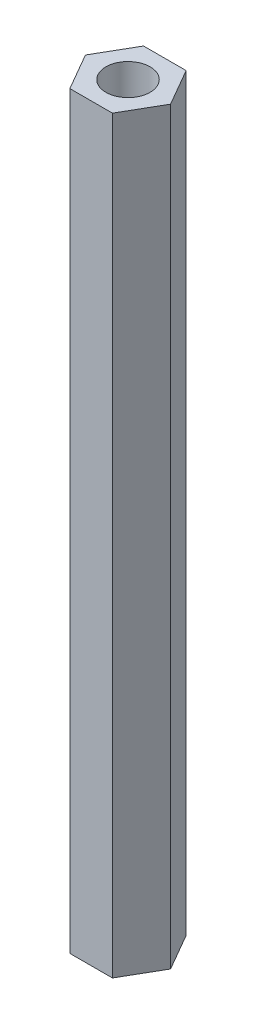
ISO-10303-21;
HEADER;
FILE_DESCRIPTION(('STEP AP214'),'2;1');
FILE_NAME('part.step','',(''),(''),'','','');
FILE_SCHEMA(('AUTOMOTIVE_DESIGN { 1 0 10303 214 1 1 1 1 }'));
ENDSEC;
DATA;
#1=APPLICATION_CONTEXT('core data for automotive mechanical design processes');
#2=APPLICATION_PROTOCOL_DEFINITION('international standard','automotive_design',2000,#1);
#3=PRODUCT_CONTEXT('',#1,'mechanical');
#4=PRODUCT('Part','Part','',(#3));
#5=PRODUCT_RELATED_PRODUCT_CATEGORY('part','',(#4));
#6=PRODUCT_DEFINITION_FORMATION('','',#4);
#7=PRODUCT_DEFINITION_CONTEXT('part definition',#1,'design');
#8=PRODUCT_DEFINITION('design','',#6,#7);
#9=PRODUCT_DEFINITION_SHAPE('','',#8);
#10=(LENGTH_UNIT() NAMED_UNIT(*) SI_UNIT(.MILLI.,.METRE.));
#11=(NAMED_UNIT(*) PLANE_ANGLE_UNIT() SI_UNIT($,.RADIAN.));
#12=(NAMED_UNIT(*) SI_UNIT($,.STERADIAN.) SOLID_ANGLE_UNIT());
#13=UNCERTAINTY_MEASURE_WITH_UNIT(LENGTH_MEASURE(1.E-05),#10,'distance_accuracy_value','');
#14=(GEOMETRIC_REPRESENTATION_CONTEXT(3) GLOBAL_UNCERTAINTY_ASSIGNED_CONTEXT((#13)) GLOBAL_UNIT_ASSIGNED_CONTEXT((#10,
#11,#12)) REPRESENTATION_CONTEXT('',''));
#15=CARTESIAN_POINT('',(0.,0.,0.));
#16=DIRECTION('',(0.,0.,1.));
#17=DIRECTION('',(1.,0.,0.));
#18=AXIS2_PLACEMENT_3D('',#15,#16,#17);
#19=CARTESIAN_POINT('',(1.44337567297408,50.8,2.49999999999999));
#20=DIRECTION('',(-0.86602540378444,0.,-0.499999999999998));
#21=DIRECTION('',(-0.499999999999998,0.,0.86602540378444));
#22=AXIS2_PLACEMENT_3D('',#19,#20,#21);
#23=PLANE('',#22);
#24=DIRECTION('',(0.499999999999998,0.,-0.86602540378444));
#25=VECTOR('',#24,1.);
#26=CARTESIAN_POINT('',(1.44337567297408,0.,2.49999999999999));
#27=LINE('',#26,#25);
#28=CARTESIAN_POINT('',(1.44337567297408,0.,2.49999999999999));
#29=VERTEX_POINT('',#28);
#30=CARTESIAN_POINT('',(2.88675134594811,0.,0.));
#31=VERTEX_POINT('',#30);
#32=EDGE_CURVE('E121',#29,#31,#27,.T.);
#33=ORIENTED_EDGE('',*,*,#32,.T.);
#34=DIRECTION('',(0.,-1.,0.));
#35=VECTOR('',#34,1.);
#36=CARTESIAN_POINT('',(2.88675134594811,50.8,0.));
#37=LINE('',#36,#35);
#38=CARTESIAN_POINT('',(2.88675134594811,50.8,0.));
#39=VERTEX_POINT('',#38);
#40=EDGE_CURVE('E11',#39,#31,#37,.T.);
#41=ORIENTED_EDGE('',*,*,#40,.F.);
#42=DIRECTION('',(0.499999999999998,0.,-0.86602540378444));
#43=VECTOR('',#42,1.);
#44=CARTESIAN_POINT('',(1.44337567297408,50.8,2.49999999999999));
#45=LINE('',#44,#43);
#46=CARTESIAN_POINT('',(1.44337567297408,50.8,2.49999999999999));
#47=VERTEX_POINT('',#46);
#48=EDGE_CURVE('E132',#47,#39,#45,.T.);
#49=ORIENTED_EDGE('',*,*,#48,.F.);
#50=DIRECTION('',(0.,-1.,0.));
#51=VECTOR('',#50,1.);
#52=CARTESIAN_POINT('',(1.44337567297408,50.8,2.49999999999999));
#53=LINE('',#52,#51);
#54=EDGE_CURVE('E117',#47,#29,#53,.T.);
#55=ORIENTED_EDGE('',*,*,#54,.T.);
#56=EDGE_LOOP('',(#33,#41,#49,#55));
#57=FACE_BOUND('',#56,.T.);
#58=ADVANCED_FACE('F37',(#57),#23,.F.);
#59=CARTESIAN_POINT('',(2.88675134594811,50.8,0.));
#60=DIRECTION('',(-0.86602540378444,0.,0.499999999999997));
#61=DIRECTION('',(0.499999999999998,0.,0.86602540378444));
#62=AXIS2_PLACEMENT_3D('',#59,#60,#61);
#63=PLANE('',#62);
#64=DIRECTION('',(-0.499999999999997,0.,-0.86602540378444));
#65=VECTOR('',#64,1.);
#66=CARTESIAN_POINT('',(2.88675134594811,0.,0.));
#67=LINE('',#66,#65);
#68=CARTESIAN_POINT('',(1.44337567297403,0.,-2.50000000000001));
#69=VERTEX_POINT('',#68);
#70=EDGE_CURVE('E124',#31,#69,#67,.T.);
#71=ORIENTED_EDGE('',*,*,#70,.T.);
#72=DIRECTION('',(0.,-1.,0.));
#73=VECTOR('',#72,1.);
#74=CARTESIAN_POINT('',(1.44337567297403,50.8,-2.50000000000001));
#75=LINE('',#74,#73);
#76=CARTESIAN_POINT('',(1.44337567297403,50.8,-2.50000000000001));
#77=VERTEX_POINT('',#76);
#78=EDGE_CURVE('E45',#77,#69,#75,.T.);
#79=ORIENTED_EDGE('',*,*,#78,.F.);
#80=DIRECTION('',(-0.499999999999997,0.,-0.86602540378444));
#81=VECTOR('',#80,1.);
#82=CARTESIAN_POINT('',(2.88675134594811,50.8,0.));
#83=LINE('',#82,#81);
#84=EDGE_CURVE('E90',#39,#77,#83,.T.);
#85=ORIENTED_EDGE('',*,*,#84,.F.);
#86=ORIENTED_EDGE('',*,*,#40,.T.);
#87=EDGE_LOOP('',(#71,#79,#85,#86));
#88=FACE_BOUND('',#87,.T.);
#89=ADVANCED_FACE('F157',(#88),#63,.F.);
#90=CARTESIAN_POINT('',(1.44337567297403,50.8,-2.50000000000001));
#91=DIRECTION('',(0.,0.,1.));
#92=DIRECTION('',(1.,0.,0.));
#93=AXIS2_PLACEMENT_3D('',#90,#91,#92);
#94=PLANE('',#93);
#95=DIRECTION('',(-1.,0.,0.));
#96=VECTOR('',#95,1.);
#97=CARTESIAN_POINT('',(1.44337567297403,0.,-2.50000000000001));
#98=LINE('',#97,#96);
#99=CARTESIAN_POINT('',(-1.44337567297408,0.,-2.5));
#100=VERTEX_POINT('',#99);
#101=EDGE_CURVE('E127',#69,#100,#98,.T.);
#102=ORIENTED_EDGE('',*,*,#101,.T.);
#103=DIRECTION('',(0.,-1.,0.));
#104=VECTOR('',#103,1.);
#105=CARTESIAN_POINT('',(-1.44337567297408,50.8,-2.5));
#106=LINE('',#105,#104);
#107=CARTESIAN_POINT('',(-1.44337567297408,50.8,-2.5));
#108=VERTEX_POINT('',#107);
#109=EDGE_CURVE('E112',#108,#100,#106,.T.);
#110=ORIENTED_EDGE('',*,*,#109,.F.);
#111=DIRECTION('',(-1.,0.,0.));
#112=VECTOR('',#111,1.);
#113=CARTESIAN_POINT('',(1.44337567297403,50.8,-2.50000000000001));
#114=LINE('',#113,#112);
#115=EDGE_CURVE('E103',#77,#108,#114,.T.);
#116=ORIENTED_EDGE('',*,*,#115,.F.);
#117=ORIENTED_EDGE('',*,*,#78,.T.);
#118=EDGE_LOOP('',(#102,#110,#116,#117));
#119=FACE_BOUND('',#118,.T.);
#120=ADVANCED_FACE('F138',(#119),#94,.F.);
#121=CARTESIAN_POINT('',(-1.44337567297408,50.8,-2.5));
#122=DIRECTION('',(0.866025403784438,0.,0.500000000000002));
#123=DIRECTION('',(0.500000000000002,0.,-0.866025403784438));
#124=AXIS2_PLACEMENT_3D('',#121,#122,#123);
#125=PLANE('',#124);
#126=DIRECTION('',(-0.500000000000002,0.,0.866025403784438));
#127=VECTOR('',#126,1.);
#128=CARTESIAN_POINT('',(-1.44337567297408,0.,-2.5));
#129=LINE('',#128,#127);
#130=CARTESIAN_POINT('',(-2.88675134594814,0.,0.));
#131=VERTEX_POINT('',#130);
#132=EDGE_CURVE('E111',#100,#131,#129,.T.);
#133=ORIENTED_EDGE('',*,*,#132,.T.);
#134=DIRECTION('',(0.,-1.,0.));
#135=VECTOR('',#134,1.);
#136=CARTESIAN_POINT('',(-2.88675134594814,50.8,0.));
#137=LINE('',#136,#135);
#138=CARTESIAN_POINT('',(-2.88675134594814,50.8,0.));
#139=VERTEX_POINT('',#138);
#140=EDGE_CURVE('E108',#139,#131,#137,.T.);
#141=ORIENTED_EDGE('',*,*,#140,.F.);
#142=DIRECTION('',(-0.500000000000002,0.,0.866025403784438));
#143=VECTOR('',#142,1.);
#144=CARTESIAN_POINT('',(-1.44337567297408,50.8,-2.5));
#145=LINE('',#144,#143);
#146=EDGE_CURVE('E97',#108,#139,#145,.T.);
#147=ORIENTED_EDGE('',*,*,#146,.F.);
#148=ORIENTED_EDGE('',*,*,#109,.T.);
#149=EDGE_LOOP('',(#133,#141,#147,#148));
#150=FACE_BOUND('',#149,.T.);
#151=ADVANCED_FACE('F109',(#150),#125,.F.);
#152=CARTESIAN_POINT('',(-2.88675134594814,50.8,0.));
#153=DIRECTION('',(0.866025403784437,0.,-0.500000000000002));
#154=DIRECTION('',(-0.500000000000002,0.,-0.866025403784438));
#155=AXIS2_PLACEMENT_3D('',#152,#153,#154);
#156=PLANE('',#155);
#157=DIRECTION('',(0.500000000000002,0.,0.866025403784438));
#158=VECTOR('',#157,1.);
#159=CARTESIAN_POINT('',(-2.88675134594814,0.,0.));
#160=LINE('',#159,#158);
#161=CARTESIAN_POINT('',(-1.44337567297406,0.,2.5));
#162=VERTEX_POINT('',#161);
#163=EDGE_CURVE('E76',#131,#162,#160,.T.);
#164=ORIENTED_EDGE('',*,*,#163,.T.);
#165=DIRECTION('',(0.,-1.,0.));
#166=VECTOR('',#165,1.);
#167=CARTESIAN_POINT('',(-1.44337567297406,50.8,2.5));
#168=LINE('',#167,#166);
#169=CARTESIAN_POINT('',(-1.44337567297406,50.8,2.5));
#170=VERTEX_POINT('',#169);
#171=EDGE_CURVE('E113',#170,#162,#168,.T.);
#172=ORIENTED_EDGE('',*,*,#171,.F.);
#173=DIRECTION('',(0.500000000000002,0.,0.866025403784438));
#174=VECTOR('',#173,1.);
#175=CARTESIAN_POINT('',(-2.88675134594814,50.8,0.));
#176=LINE('',#175,#174);
#177=EDGE_CURVE('E101',#139,#170,#176,.T.);
#178=ORIENTED_EDGE('',*,*,#177,.F.);
#179=ORIENTED_EDGE('',*,*,#140,.T.);
#180=EDGE_LOOP('',(#164,#172,#178,#179));
#181=FACE_BOUND('',#180,.T.);
#182=ADVANCED_FACE('F115',(#181),#156,.F.);
#183=CARTESIAN_POINT('',(-1.44337567297406,50.8,2.5));
#184=DIRECTION('',(0.,0.,-1.));
#185=DIRECTION('',(-1.,0.,0.));
#186=AXIS2_PLACEMENT_3D('',#183,#184,#185);
#187=PLANE('',#186);
#188=DIRECTION('',(1.,0.,0.));
#189=VECTOR('',#188,1.);
#190=CARTESIAN_POINT('',(-1.44337567297406,0.,2.5));
#191=LINE('',#190,#189);
#192=EDGE_CURVE('E82',#162,#29,#191,.T.);
#193=ORIENTED_EDGE('',*,*,#192,.T.);
#194=ORIENTED_EDGE('',*,*,#54,.F.);
#195=DIRECTION('',(1.,0.,0.));
#196=VECTOR('',#195,1.);
#197=CARTESIAN_POINT('',(-1.44337567297406,50.8,2.5));
#198=LINE('',#197,#196);
#199=EDGE_CURVE('E53',#170,#47,#198,.T.);
#200=ORIENTED_EDGE('',*,*,#199,.F.);
#201=ORIENTED_EDGE('',*,*,#171,.T.);
#202=EDGE_LOOP('',(#193,#194,#200,#201));
#203=FACE_BOUND('',#202,.T.);
#204=ADVANCED_FACE('F145',(#203),#187,.F.);
#205=CARTESIAN_POINT('',(0.,50.8,0.));
#206=DIRECTION('',(0.,1.,0.));
#207=DIRECTION('',(0.,0.,1.));
#208=AXIS2_PLACEMENT_3D('',#205,#206,#207);
#209=PLANE('',#208);
#210=CARTESIAN_POINT('',(0.,50.8,0.));
#211=DIRECTION('',(0.,1.,0.));
#212=DIRECTION('',(0.,0.,1.));
#213=AXIS2_PLACEMENT_3D('',#210,#211,#212);
#214=CIRCLE('',#213,1.5);
#215=CARTESIAN_POINT('',(0.,50.8,1.5));
#216=VERTEX_POINT('',#215);
#217=EDGE_CURVE('E244',#216,#216,#214,.T.);
#218=ORIENTED_EDGE('',*,*,#217,.F.);
#219=EDGE_LOOP('',(#218));
#220=FACE_BOUND('',#219,.T.);
#221=ORIENTED_EDGE('',*,*,#48,.T.);
#222=ORIENTED_EDGE('',*,*,#84,.T.);
#223=ORIENTED_EDGE('',*,*,#115,.T.);
#224=ORIENTED_EDGE('',*,*,#146,.T.);
#225=ORIENTED_EDGE('',*,*,#177,.T.);
#226=ORIENTED_EDGE('',*,*,#199,.T.);
#227=EDGE_LOOP('',(#221,#222,#223,#224,#225,#226));
#228=FACE_BOUND('',#227,.T.);
#229=ADVANCED_FACE('F99',(#220,#228),#209,.T.);
#230=CARTESIAN_POINT('',(0.,0.,0.));
#231=DIRECTION('',(0.,1.,0.));
#232=DIRECTION('',(0.,0.,1.));
#233=AXIS2_PLACEMENT_3D('',#230,#231,#232);
#234=PLANE('',#233);
#235=CARTESIAN_POINT('',(0.,0.,0.));
#236=DIRECTION('',(0.,1.,0.));
#237=DIRECTION('',(0.,0.,1.));
#238=AXIS2_PLACEMENT_3D('',#235,#236,#237);
#239=CIRCLE('',#238,1.5);
#240=CARTESIAN_POINT('',(0.,0.,1.5));
#241=VERTEX_POINT('',#240);
#242=EDGE_CURVE('E125',#241,#241,#239,.T.);
#243=ORIENTED_EDGE('',*,*,#242,.T.);
#244=EDGE_LOOP('',(#243));
#245=FACE_BOUND('',#244,.T.);
#246=ORIENTED_EDGE('',*,*,#32,.F.);
#247=ORIENTED_EDGE('',*,*,#192,.F.);
#248=ORIENTED_EDGE('',*,*,#163,.F.);
#249=ORIENTED_EDGE('',*,*,#132,.F.);
#250=ORIENTED_EDGE('',*,*,#101,.F.);
#251=ORIENTED_EDGE('',*,*,#70,.F.);
#252=EDGE_LOOP('',(#246,#247,#248,#249,#250,#251));
#253=FACE_BOUND('',#252,.T.);
#254=ADVANCED_FACE('F141',(#245,#253),#234,.F.);
#255=CARTESIAN_POINT('',(0.,0.,0.));
#256=DIRECTION('',(0.,1.,0.));
#257=DIRECTION('',(0.,0.,1.));
#258=AXIS2_PLACEMENT_3D('',#255,#256,#257);
#259=CYLINDRICAL_SURFACE('',#258,1.5);
#260=ORIENTED_EDGE('',*,*,#242,.F.);
#261=EDGE_LOOP('',(#260));
#262=FACE_BOUND('',#261,.T.);
#263=ORIENTED_EDGE('',*,*,#217,.T.);
#264=EDGE_LOOP('',(#263));
#265=FACE_BOUND('',#264,.T.);
#266=ADVANCED_FACE('F197',(#262,#265),#259,.F.);
#267=CLOSED_SHELL('',(#58,#89,#120,#151,#182,#204,#229,#254,#266));
#268=MANIFOLD_SOLID_BREP('B2',#267);
#269=ADVANCED_BREP_SHAPE_REPRESENTATION('',(#18,#268),#14);
#270=SHAPE_DEFINITION_REPRESENTATION(#9,#269);
ENDSEC;
END-ISO-10303-21;
